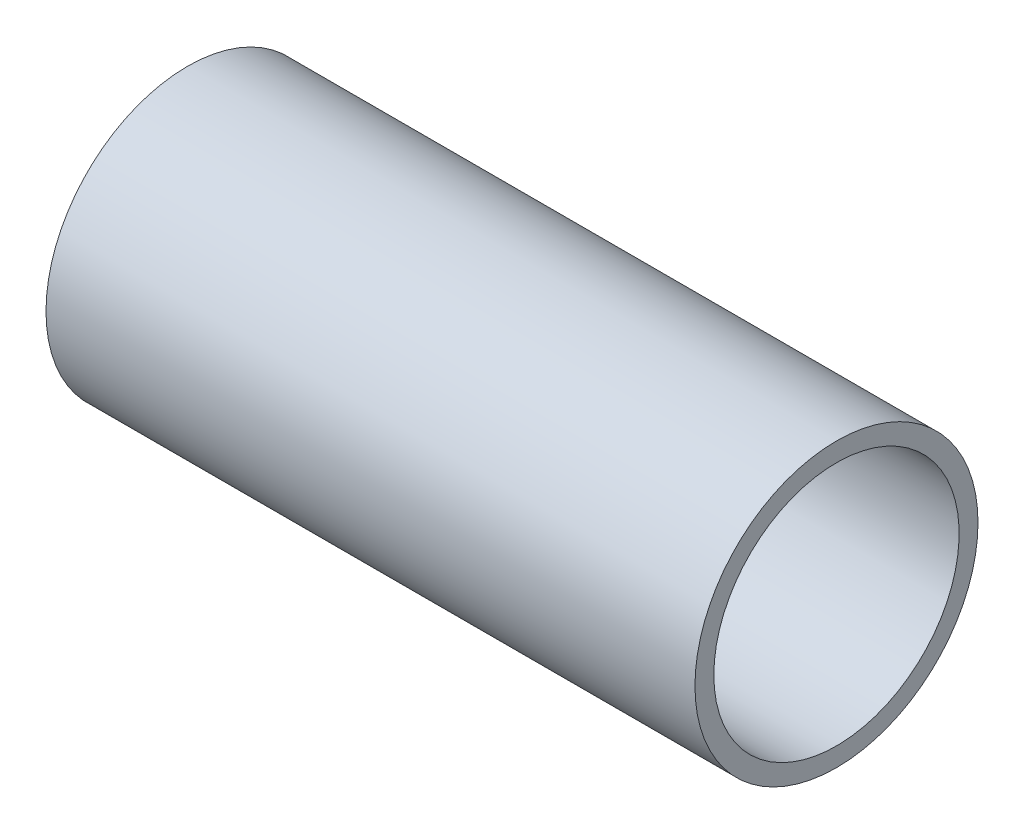
ISO-10303-21;
HEADER;
FILE_DESCRIPTION(('STEP AP214'),'2;1');
FILE_NAME('part.step','',(''),(''),'','','');
FILE_SCHEMA(('AUTOMOTIVE_DESIGN { 1 0 10303 214 1 1 1 1 }'));
ENDSEC;
DATA;
#1=APPLICATION_CONTEXT('core data for automotive mechanical design processes');
#2=APPLICATION_PROTOCOL_DEFINITION('international standard','automotive_design',2000,#1);
#3=PRODUCT_CONTEXT('',#1,'mechanical');
#4=PRODUCT('Part','Part','',(#3));
#5=PRODUCT_RELATED_PRODUCT_CATEGORY('part','',(#4));
#6=PRODUCT_DEFINITION_FORMATION('','',#4);
#7=PRODUCT_DEFINITION_CONTEXT('part definition',#1,'design');
#8=PRODUCT_DEFINITION('design','',#6,#7);
#9=PRODUCT_DEFINITION_SHAPE('','',#8);
#10=(LENGTH_UNIT() NAMED_UNIT(*) SI_UNIT(.MILLI.,.METRE.));
#11=(NAMED_UNIT(*) PLANE_ANGLE_UNIT() SI_UNIT($,.RADIAN.));
#12=(NAMED_UNIT(*) SI_UNIT($,.STERADIAN.) SOLID_ANGLE_UNIT());
#13=UNCERTAINTY_MEASURE_WITH_UNIT(LENGTH_MEASURE(1.E-05),#10,'distance_accuracy_value','');
#14=(GEOMETRIC_REPRESENTATION_CONTEXT(3) GLOBAL_UNCERTAINTY_ASSIGNED_CONTEXT((#13)) GLOBAL_UNIT_ASSIGNED_CONTEXT((#10,
#11,#12)) REPRESENTATION_CONTEXT('',''));
#15=CARTESIAN_POINT('',(0.,0.,0.));
#16=DIRECTION('',(0.,0.,1.));
#17=DIRECTION('',(1.,0.,0.));
#18=AXIS2_PLACEMENT_3D('',#15,#16,#17);
#19=CARTESIAN_POINT('',(17.1958,0.,0.));
#20=DIRECTION('',(-1.,0.,0.));
#21=DIRECTION('',(0.,0.,1.));
#22=AXIS2_PLACEMENT_3D('',#19,#20,#21);
#23=CYLINDRICAL_SURFACE('',#22,6.5);
#24=CARTESIAN_POINT('',(-17.1958,0.,0.));
#25=DIRECTION('',(-1.,0.,0.));
#26=DIRECTION('',(0.,0.,1.));
#27=AXIS2_PLACEMENT_3D('',#24,#25,#26);
#28=CIRCLE('',#27,6.5);
#29=CARTESIAN_POINT('',(-17.1958,0.,6.5));
#30=VERTEX_POINT('',#29);
#31=EDGE_CURVE('E27',#30,#30,#28,.T.);
#32=ORIENTED_EDGE('',*,*,#31,.T.);
#33=EDGE_LOOP('',(#32));
#34=FACE_BOUND('',#33,.T.);
#35=CARTESIAN_POINT('',(17.1958,0.,0.));
#36=DIRECTION('',(-1.,0.,0.));
#37=DIRECTION('',(0.,0.,1.));
#38=AXIS2_PLACEMENT_3D('',#35,#36,#37);
#39=CIRCLE('',#38,6.5);
#40=CARTESIAN_POINT('',(17.1958,0.,6.5));
#41=VERTEX_POINT('',#40);
#42=EDGE_CURVE('E18',#41,#41,#39,.T.);
#43=ORIENTED_EDGE('',*,*,#42,.F.);
#44=EDGE_LOOP('',(#43));
#45=FACE_BOUND('',#44,.T.);
#46=ADVANCED_FACE('F15',(#34,#45),#23,.F.);
#47=CARTESIAN_POINT('',(17.1958,0.,0.));
#48=DIRECTION('',(1.,0.,0.));
#49=DIRECTION('',(0.,0.,-1.));
#50=AXIS2_PLACEMENT_3D('',#47,#48,#49);
#51=PLANE('',#50);
#52=ORIENTED_EDGE('',*,*,#42,.T.);
#53=EDGE_LOOP('',(#52));
#54=FACE_BOUND('',#53,.T.);
#55=CARTESIAN_POINT('',(17.1958,0.,0.));
#56=DIRECTION('',(-1.,0.,0.));
#57=DIRECTION('',(0.,0.,1.));
#58=AXIS2_PLACEMENT_3D('',#55,#56,#57);
#59=CIRCLE('',#58,7.5);
#60=CARTESIAN_POINT('',(17.1958,0.,7.5));
#61=VERTEX_POINT('',#60);
#62=EDGE_CURVE('E22',#61,#61,#59,.T.);
#63=ORIENTED_EDGE('',*,*,#62,.F.);
#64=EDGE_LOOP('',(#63));
#65=FACE_BOUND('',#64,.T.);
#66=ADVANCED_FACE('F35',(#54,#65),#51,.T.);
#67=CARTESIAN_POINT('',(-17.1958,0.,0.));
#68=DIRECTION('',(1.,0.,0.));
#69=DIRECTION('',(0.,0.,-1.));
#70=AXIS2_PLACEMENT_3D('',#67,#68,#69);
#71=PLANE('',#70);
#72=ORIENTED_EDGE('',*,*,#31,.F.);
#73=EDGE_LOOP('',(#72));
#74=FACE_BOUND('',#73,.T.);
#75=CARTESIAN_POINT('',(-17.1958,0.,0.));
#76=DIRECTION('',(-1.,0.,0.));
#77=DIRECTION('',(0.,0.,1.));
#78=AXIS2_PLACEMENT_3D('',#75,#76,#77);
#79=CIRCLE('',#78,7.5);
#80=CARTESIAN_POINT('',(-17.1958,0.,7.5));
#81=VERTEX_POINT('',#80);
#82=EDGE_CURVE('E10',#81,#81,#79,.F.);
#83=ORIENTED_EDGE('',*,*,#82,.F.);
#84=EDGE_LOOP('',(#83));
#85=FACE_BOUND('',#84,.T.);
#86=ADVANCED_FACE('F43',(#74,#85),#71,.F.);
#87=CARTESIAN_POINT('',(17.1958,0.,0.));
#88=DIRECTION('',(-1.,0.,0.));
#89=DIRECTION('',(0.,0.,1.));
#90=AXIS2_PLACEMENT_3D('',#87,#88,#89);
#91=CYLINDRICAL_SURFACE('',#90,7.5);
#92=ORIENTED_EDGE('',*,*,#82,.T.);
#93=EDGE_LOOP('',(#92));
#94=FACE_BOUND('',#93,.T.);
#95=ORIENTED_EDGE('',*,*,#62,.T.);
#96=EDGE_LOOP('',(#95));
#97=FACE_BOUND('',#96,.T.);
#98=ADVANCED_FACE('F44',(#94,#97),#91,.T.);
#99=CLOSED_SHELL('',(#46,#66,#86,#98));
#100=MANIFOLD_SOLID_BREP('B1',#99);
#101=ADVANCED_BREP_SHAPE_REPRESENTATION('',(#18,#100),#14);
#102=SHAPE_DEFINITION_REPRESENTATION(#9,#101);
ENDSEC;
END-ISO-10303-21;
